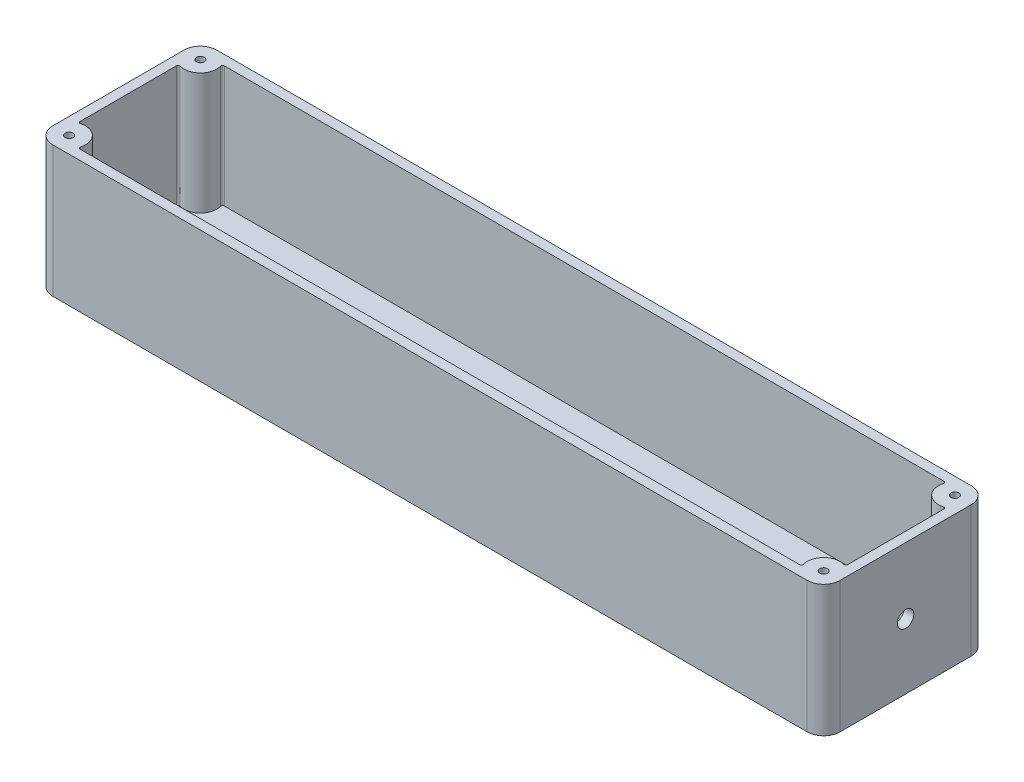
ISO-10303-21;
HEADER;
FILE_DESCRIPTION(('STEP AP214'),'2;1');
FILE_NAME('part.step','',(''),(''),'','','');
FILE_SCHEMA(('AUTOMOTIVE_DESIGN { 1 0 10303 214 1 1 1 1 }'));
ENDSEC;
DATA;
#1=APPLICATION_CONTEXT('core data for automotive mechanical design processes');
#2=APPLICATION_PROTOCOL_DEFINITION('international standard','automotive_design',2000,#1);
#3=PRODUCT_CONTEXT('',#1,'mechanical');
#4=PRODUCT('Part','Part','',(#3));
#5=PRODUCT_RELATED_PRODUCT_CATEGORY('part','',(#4));
#6=PRODUCT_DEFINITION_FORMATION('','',#4);
#7=PRODUCT_DEFINITION_CONTEXT('part definition',#1,'design');
#8=PRODUCT_DEFINITION('design','',#6,#7);
#9=PRODUCT_DEFINITION_SHAPE('','',#8);
#10=(LENGTH_UNIT() NAMED_UNIT(*) SI_UNIT(.MILLI.,.METRE.));
#11=(NAMED_UNIT(*) PLANE_ANGLE_UNIT() SI_UNIT($,.RADIAN.));
#12=(NAMED_UNIT(*) SI_UNIT($,.STERADIAN.) SOLID_ANGLE_UNIT());
#13=UNCERTAINTY_MEASURE_WITH_UNIT(LENGTH_MEASURE(1.E-05),#10,'distance_accuracy_value','');
#14=(GEOMETRIC_REPRESENTATION_CONTEXT(3) GLOBAL_UNCERTAINTY_ASSIGNED_CONTEXT((#13)) GLOBAL_UNIT_ASSIGNED_CONTEXT((#10,
#11,#12)) REPRESENTATION_CONTEXT('',''));
#15=CARTESIAN_POINT('',(0.,0.,0.));
#16=DIRECTION('',(0.,0.,1.));
#17=DIRECTION('',(1.,0.,0.));
#18=AXIS2_PLACEMENT_3D('',#15,#16,#17);
#19=CARTESIAN_POINT('',(115.,40.,-20.));
#20=DIRECTION('',(0.,-1.,0.));
#21=DIRECTION('',(0.,0.,-1.));
#22=AXIS2_PLACEMENT_3D('',#19,#20,#21);
#23=CYLINDRICAL_SURFACE('',#22,5.);
#24=CARTESIAN_POINT('',(115.,0.,-20.));
#25=DIRECTION('',(0.,1.,0.));
#26=DIRECTION('',(0.,0.,-1.));
#27=AXIS2_PLACEMENT_3D('',#24,#25,#26);
#28=CIRCLE('',#27,5.);
#29=CARTESIAN_POINT('',(120.,0.,-20.));
#30=VERTEX_POINT('',#29);
#31=CARTESIAN_POINT('',(115.,0.,-25.));
#32=VERTEX_POINT('',#31);
#33=EDGE_CURVE('E152',#30,#32,#28,.T.);
#34=ORIENTED_EDGE('',*,*,#33,.T.);
#35=DIRECTION('',(0.,-1.,0.));
#36=VECTOR('',#35,1.);
#37=CARTESIAN_POINT('',(115.,40.,-25.));
#38=LINE('',#37,#36);
#39=CARTESIAN_POINT('',(115.,40.,-25.));
#40=VERTEX_POINT('',#39);
#41=EDGE_CURVE('E11',#40,#32,#38,.T.);
#42=ORIENTED_EDGE('',*,*,#41,.F.);
#43=CARTESIAN_POINT('',(115.,40.,-20.));
#44=DIRECTION('',(0.,1.,0.));
#45=DIRECTION('',(0.,0.,-1.));
#46=AXIS2_PLACEMENT_3D('',#43,#44,#45);
#47=CIRCLE('',#46,5.);
#48=CARTESIAN_POINT('',(120.,40.,-20.));
#49=VERTEX_POINT('',#48);
#50=EDGE_CURVE('E176',#49,#40,#47,.T.);
#51=ORIENTED_EDGE('',*,*,#50,.F.);
#52=DIRECTION('',(0.,-1.,0.));
#53=VECTOR('',#52,1.);
#54=CARTESIAN_POINT('',(120.,40.,-20.));
#55=LINE('',#54,#53);
#56=EDGE_CURVE('E148',#49,#30,#55,.T.);
#57=ORIENTED_EDGE('',*,*,#56,.T.);
#58=EDGE_LOOP('',(#34,#42,#51,#57));
#59=FACE_BOUND('',#58,.T.);
#60=ADVANCED_FACE('F38',(#59),#23,.T.);
#61=CARTESIAN_POINT('',(-115.,40.,-25.));
#62=DIRECTION('',(0.,0.,1.));
#63=DIRECTION('',(1.,0.,0.));
#64=AXIS2_PLACEMENT_3D('',#61,#62,#63);
#65=PLANE('',#64);
#66=DIRECTION('',(-1.,0.,0.));
#67=VECTOR('',#66,1.);
#68=CARTESIAN_POINT('',(-115.,0.,-25.));
#69=LINE('',#68,#67);
#70=CARTESIAN_POINT('',(-115.,0.,-25.));
#71=VERTEX_POINT('',#70);
#72=EDGE_CURVE('E156',#32,#71,#69,.T.);
#73=ORIENTED_EDGE('',*,*,#72,.T.);
#74=DIRECTION('',(0.,-1.,0.));
#75=VECTOR('',#74,1.);
#76=CARTESIAN_POINT('',(-115.,40.,-25.));
#77=LINE('',#76,#75);
#78=CARTESIAN_POINT('',(-115.,40.,-25.));
#79=VERTEX_POINT('',#78);
#80=EDGE_CURVE('E47',#79,#71,#77,.T.);
#81=ORIENTED_EDGE('',*,*,#80,.F.);
#82=DIRECTION('',(-1.,0.,0.));
#83=VECTOR('',#82,1.);
#84=CARTESIAN_POINT('',(-115.,40.,-25.));
#85=LINE('',#84,#83);
#86=EDGE_CURVE('E104',#40,#79,#85,.T.);
#87=ORIENTED_EDGE('',*,*,#86,.F.);
#88=ORIENTED_EDGE('',*,*,#41,.T.);
#89=EDGE_LOOP('',(#73,#81,#87,#88));
#90=FACE_BOUND('',#89,.T.);
#91=ADVANCED_FACE('F463',(#90),#65,.F.);
#92=CARTESIAN_POINT('',(-115.,40.,-20.));
#93=DIRECTION('',(0.,-1.,0.));
#94=DIRECTION('',(0.,0.,-1.));
#95=AXIS2_PLACEMENT_3D('',#92,#93,#94);
#96=CYLINDRICAL_SURFACE('',#95,5.);
#97=CARTESIAN_POINT('',(-115.,0.,-20.));
#98=DIRECTION('',(0.,1.,0.));
#99=DIRECTION('',(0.,0.,1.));
#100=AXIS2_PLACEMENT_3D('',#97,#98,#99);
#101=CIRCLE('',#100,5.);
#102=CARTESIAN_POINT('',(-120.,0.,-20.));
#103=VERTEX_POINT('',#102);
#104=EDGE_CURVE('E160',#71,#103,#101,.T.);
#105=ORIENTED_EDGE('',*,*,#104,.T.);
#106=DIRECTION('',(0.,-1.,0.));
#107=VECTOR('',#106,1.);
#108=CARTESIAN_POINT('',(-120.,40.,-20.));
#109=LINE('',#108,#107);
#110=CARTESIAN_POINT('',(-120.,40.,-20.));
#111=VERTEX_POINT('',#110);
#112=EDGE_CURVE('E187',#111,#103,#109,.T.);
#113=ORIENTED_EDGE('',*,*,#112,.F.);
#114=CARTESIAN_POINT('',(-115.,40.,-20.));
#115=DIRECTION('',(0.,1.,0.));
#116=DIRECTION('',(0.,0.,1.));
#117=AXIS2_PLACEMENT_3D('',#114,#115,#116);
#118=CIRCLE('',#117,5.);
#119=EDGE_CURVE('E198',#79,#111,#118,.T.);
#120=ORIENTED_EDGE('',*,*,#119,.F.);
#121=ORIENTED_EDGE('',*,*,#80,.T.);
#122=EDGE_LOOP('',(#105,#113,#120,#121));
#123=FACE_BOUND('',#122,.T.);
#124=ADVANCED_FACE('F196',(#123),#96,.T.);
#125=CARTESIAN_POINT('',(-120.,40.,-20.));
#126=DIRECTION('',(1.,0.,0.));
#127=DIRECTION('',(0.,0.,-1.));
#128=AXIS2_PLACEMENT_3D('',#125,#126,#127);
#129=PLANE('',#128);
#130=DIRECTION('',(0.,0.,1.));
#131=VECTOR('',#130,1.);
#132=CARTESIAN_POINT('',(-120.,0.,-20.));
#133=LINE('',#132,#131);
#134=CARTESIAN_POINT('',(-120.,0.,20.));
#135=VERTEX_POINT('',#134);
#136=EDGE_CURVE('E163',#103,#135,#133,.T.);
#137=ORIENTED_EDGE('',*,*,#136,.T.);
#138=DIRECTION('',(0.,-1.,0.));
#139=VECTOR('',#138,1.);
#140=CARTESIAN_POINT('',(-120.,40.,20.));
#141=LINE('',#140,#139);
#142=CARTESIAN_POINT('',(-120.,40.,20.));
#143=VERTEX_POINT('',#142);
#144=EDGE_CURVE('E183',#143,#135,#141,.T.);
#145=ORIENTED_EDGE('',*,*,#144,.F.);
#146=DIRECTION('',(0.,0.,1.));
#147=VECTOR('',#146,1.);
#148=CARTESIAN_POINT('',(-120.,40.,-20.));
#149=LINE('',#148,#147);
#150=EDGE_CURVE('E211',#111,#143,#149,.T.);
#151=ORIENTED_EDGE('',*,*,#150,.F.);
#152=ORIENTED_EDGE('',*,*,#112,.T.);
#153=EDGE_LOOP('',(#137,#145,#151,#152));
#154=FACE_BOUND('',#153,.T.);
#155=ADVANCED_FACE('F206',(#154),#129,.F.);
#156=CARTESIAN_POINT('',(-115.,40.,20.));
#157=DIRECTION('',(0.,-1.,0.));
#158=DIRECTION('',(0.,0.,-1.));
#159=AXIS2_PLACEMENT_3D('',#156,#157,#158);
#160=CYLINDRICAL_SURFACE('',#159,5.);
#161=CARTESIAN_POINT('',(-115.,0.,20.));
#162=DIRECTION('',(0.,1.,0.));
#163=DIRECTION('',(0.,0.,1.));
#164=AXIS2_PLACEMENT_3D('',#161,#162,#163);
#165=CIRCLE('',#164,5.);
#166=CARTESIAN_POINT('',(-115.,0.,25.));
#167=VERTEX_POINT('',#166);
#168=EDGE_CURVE('E166',#135,#167,#165,.T.);
#169=ORIENTED_EDGE('',*,*,#168,.T.);
#170=DIRECTION('',(0.,-1.,0.));
#171=VECTOR('',#170,1.);
#172=CARTESIAN_POINT('',(-115.,40.,25.));
#173=LINE('',#172,#171);
#174=CARTESIAN_POINT('',(-115.,40.,25.));
#175=VERTEX_POINT('',#174);
#176=EDGE_CURVE('E141',#175,#167,#173,.T.);
#177=ORIENTED_EDGE('',*,*,#176,.F.);
#178=CARTESIAN_POINT('',(-115.,40.,20.));
#179=DIRECTION('',(0.,1.,0.));
#180=DIRECTION('',(0.,0.,1.));
#181=AXIS2_PLACEMENT_3D('',#178,#179,#180);
#182=CIRCLE('',#181,5.);
#183=EDGE_CURVE('E127',#143,#175,#182,.T.);
#184=ORIENTED_EDGE('',*,*,#183,.F.);
#185=ORIENTED_EDGE('',*,*,#144,.T.);
#186=EDGE_LOOP('',(#169,#177,#184,#185));
#187=FACE_BOUND('',#186,.T.);
#188=ADVANCED_FACE('F209',(#187),#160,.T.);
#189=CARTESIAN_POINT('',(-115.,40.,25.));
#190=DIRECTION('',(0.,0.,-1.));
#191=DIRECTION('',(-1.,0.,0.));
#192=AXIS2_PLACEMENT_3D('',#189,#190,#191);
#193=PLANE('',#192);
#194=DIRECTION('',(1.,0.,0.));
#195=VECTOR('',#194,1.);
#196=CARTESIAN_POINT('',(-115.,0.,25.));
#197=LINE('',#196,#195);
#198=CARTESIAN_POINT('',(115.,0.,25.));
#199=VERTEX_POINT('',#198);
#200=EDGE_CURVE('E137',#167,#199,#197,.T.);
#201=ORIENTED_EDGE('',*,*,#200,.T.);
#202=DIRECTION('',(0.,-1.,0.));
#203=VECTOR('',#202,1.);
#204=CARTESIAN_POINT('',(115.,40.,25.));
#205=LINE('',#204,#203);
#206=CARTESIAN_POINT('',(115.,40.,25.));
#207=VERTEX_POINT('',#206);
#208=EDGE_CURVE('E134',#207,#199,#205,.T.);
#209=ORIENTED_EDGE('',*,*,#208,.F.);
#210=DIRECTION('',(1.,0.,0.));
#211=VECTOR('',#210,1.);
#212=CARTESIAN_POINT('',(-115.,40.,25.));
#213=LINE('',#212,#211);
#214=EDGE_CURVE('E120',#175,#207,#213,.T.);
#215=ORIENTED_EDGE('',*,*,#214,.F.);
#216=ORIENTED_EDGE('',*,*,#176,.T.);
#217=EDGE_LOOP('',(#201,#209,#215,#216));
#218=FACE_BOUND('',#217,.T.);
#219=ADVANCED_FACE('F135',(#218),#193,.F.);
#220=CARTESIAN_POINT('',(115.,40.,20.));
#221=DIRECTION('',(0.,-1.,0.));
#222=DIRECTION('',(0.,0.,-1.));
#223=AXIS2_PLACEMENT_3D('',#220,#221,#222);
#224=CYLINDRICAL_SURFACE('',#223,5.);
#225=CARTESIAN_POINT('',(115.,0.,20.));
#226=DIRECTION('',(0.,1.,0.));
#227=DIRECTION('',(0.,0.,1.));
#228=AXIS2_PLACEMENT_3D('',#225,#226,#227);
#229=CIRCLE('',#228,5.);
#230=CARTESIAN_POINT('',(120.,0.,20.));
#231=VERTEX_POINT('',#230);
#232=EDGE_CURVE('E171',#199,#231,#229,.T.);
#233=ORIENTED_EDGE('',*,*,#232,.T.);
#234=DIRECTION('',(0.,-1.,0.));
#235=VECTOR('',#234,1.);
#236=CARTESIAN_POINT('',(120.,40.,20.));
#237=LINE('',#236,#235);
#238=CARTESIAN_POINT('',(120.,40.,20.));
#239=VERTEX_POINT('',#238);
#240=EDGE_CURVE('E142',#239,#231,#237,.T.);
#241=ORIENTED_EDGE('',*,*,#240,.F.);
#242=CARTESIAN_POINT('',(115.,40.,20.));
#243=DIRECTION('',(0.,1.,0.));
#244=DIRECTION('',(0.,0.,1.));
#245=AXIS2_PLACEMENT_3D('',#242,#243,#244);
#246=CIRCLE('',#245,5.);
#247=EDGE_CURVE('E124',#207,#239,#246,.T.);
#248=ORIENTED_EDGE('',*,*,#247,.F.);
#249=ORIENTED_EDGE('',*,*,#208,.T.);
#250=EDGE_LOOP('',(#233,#241,#248,#249));
#251=FACE_BOUND('',#250,.T.);
#252=ADVANCED_FACE('F144',(#251),#224,.T.);
#253=CARTESIAN_POINT('',(120.,40.,-20.));
#254=DIRECTION('',(-1.,0.,0.));
#255=DIRECTION('',(0.,0.,1.));
#256=AXIS2_PLACEMENT_3D('',#253,#254,#255);
#257=PLANE('',#256);
#258=CARTESIAN_POINT('',(120.,19.8177670051511,0.));
#259=DIRECTION('',(1.,0.,0.));
#260=DIRECTION('',(0.,0.,-1.));
#261=AXIS2_PLACEMENT_3D('',#258,#259,#260);
#262=CIRCLE('',#261,2.5);
#263=CARTESIAN_POINT('',(120.,19.8177670051511,-2.50000000000004));
#264=VERTEX_POINT('',#263);
#265=EDGE_CURVE('E440',#264,#264,#262,.T.);
#266=ORIENTED_EDGE('',*,*,#265,.F.);
#267=EDGE_LOOP('',(#266));
#268=FACE_BOUND('',#267,.T.);
#269=DIRECTION('',(0.,0.,-1.));
#270=VECTOR('',#269,1.);
#271=CARTESIAN_POINT('',(120.,0.,-20.));
#272=LINE('',#271,#270);
#273=EDGE_CURVE('E96',#231,#30,#272,.T.);
#274=ORIENTED_EDGE('',*,*,#273,.T.);
#275=ORIENTED_EDGE('',*,*,#56,.F.);
#276=DIRECTION('',(0.,0.,-1.));
#277=VECTOR('',#276,1.);
#278=CARTESIAN_POINT('',(120.,40.,-20.));
#279=LINE('',#278,#277);
#280=EDGE_CURVE('E63',#239,#49,#279,.T.);
#281=ORIENTED_EDGE('',*,*,#280,.F.);
#282=ORIENTED_EDGE('',*,*,#240,.T.);
#283=EDGE_LOOP('',(#274,#275,#281,#282));
#284=FACE_BOUND('',#283,.T.);
#285=ADVANCED_FACE('F470',(#268,#284),#257,.F.);
#286=CARTESIAN_POINT('',(115.,40.,-20.));
#287=DIRECTION('',(0.,-1.,0.));
#288=DIRECTION('',(0.,0.,-1.));
#289=AXIS2_PLACEMENT_3D('',#286,#287,#288);
#290=PLANE('',#289);
#291=CARTESIAN_POINT('',(-115.,40.,-20.));
#292=DIRECTION('',(0.,1.,0.));
#293=DIRECTION('',(0.,0.,1.));
#294=AXIS2_PLACEMENT_3D('',#291,#292,#293);
#295=CIRCLE('',#294,1.19999999999999);
#296=CARTESIAN_POINT('',(-115.,40.,-18.8));
#297=VERTEX_POINT('',#296);
#298=EDGE_CURVE('E436',#297,#297,#295,.T.);
#299=ORIENTED_EDGE('',*,*,#298,.F.);
#300=EDGE_LOOP('',(#299));
#301=FACE_BOUND('',#300,.T.);
#302=CARTESIAN_POINT('',(-115.,40.,20.));
#303=DIRECTION('',(0.,1.,0.));
#304=DIRECTION('',(0.,0.,1.));
#305=AXIS2_PLACEMENT_3D('',#302,#303,#304);
#306=CIRCLE('',#305,1.19999999999999);
#307=CARTESIAN_POINT('',(-115.,40.,21.2));
#308=VERTEX_POINT('',#307);
#309=EDGE_CURVE('E428',#308,#308,#306,.T.);
#310=ORIENTED_EDGE('',*,*,#309,.F.);
#311=EDGE_LOOP('',(#310));
#312=FACE_BOUND('',#311,.T.);
#313=CARTESIAN_POINT('',(115.,40.,20.));
#314=DIRECTION('',(0.,1.,0.));
#315=DIRECTION('',(0.,0.,1.));
#316=AXIS2_PLACEMENT_3D('',#313,#314,#315);
#317=CIRCLE('',#316,1.19999999999999);
#318=CARTESIAN_POINT('',(115.,40.,21.2));
#319=VERTEX_POINT('',#318);
#320=EDGE_CURVE('E420',#319,#319,#317,.T.);
#321=ORIENTED_EDGE('',*,*,#320,.F.);
#322=EDGE_LOOP('',(#321));
#323=FACE_BOUND('',#322,.T.);
#324=CARTESIAN_POINT('',(115.,40.,-20.));
#325=DIRECTION('',(0.,1.,0.));
#326=DIRECTION('',(0.,0.,1.));
#327=AXIS2_PLACEMENT_3D('',#324,#325,#326);
#328=CIRCLE('',#327,1.19999999999999);
#329=CARTESIAN_POINT('',(115.,40.,-18.8));
#330=VERTEX_POINT('',#329);
#331=EDGE_CURVE('E412',#330,#330,#328,.T.);
#332=ORIENTED_EDGE('',*,*,#331,.F.);
#333=EDGE_LOOP('',(#332));
#334=FACE_BOUND('',#333,.T.);
#335=CARTESIAN_POINT('',(115.,40.,-20.));
#336=DIRECTION('',(0.,1.,0.));
#337=DIRECTION('',(0.,0.,1.));
#338=AXIS2_PLACEMENT_3D('',#335,#336,#337);
#339=CIRCLE('',#338,4.99999999999999);
#340=CARTESIAN_POINT('',(110.189543070792,40.,-21.3636363636363));
#341=VERTEX_POINT('',#340);
#342=CARTESIAN_POINT('',(116.363636363636,40.,-15.1895430707916));
#343=VERTEX_POINT('',#342);
#344=EDGE_CURVE('E54',#341,#343,#339,.T.);
#345=ORIENTED_EDGE('',*,*,#344,.T.);
#346=CARTESIAN_POINT('',(116.5,40.,-14.7084973778708));
#347=DIRECTION('',(0.,1.,0.));
#348=DIRECTION('',(0.,0.,1.));
#349=AXIS2_PLACEMENT_3D('',#346,#347,#348);
#350=CIRCLE('',#349,0.499999999999979);
#351=CARTESIAN_POINT('',(117.,40.,-14.7084973778708));
#352=VERTEX_POINT('',#351);
#353=EDGE_CURVE('E283',#343,#352,#350,.F.);
#354=ORIENTED_EDGE('',*,*,#353,.T.);
#355=DIRECTION('',(0.,0.,-1.));
#356=VECTOR('',#355,1.);
#357=CARTESIAN_POINT('',(117.,40.,0.));
#358=LINE('',#357,#356);
#359=CARTESIAN_POINT('',(117.,40.,14.7084973778708));
#360=VERTEX_POINT('',#359);
#361=EDGE_CURVE('E288',#360,#352,#358,.T.);
#362=ORIENTED_EDGE('',*,*,#361,.F.);
#363=CARTESIAN_POINT('',(116.5,40.,14.7084973778708));
#364=DIRECTION('',(0.,1.,0.));
#365=DIRECTION('',(0.,0.,1.));
#366=AXIS2_PLACEMENT_3D('',#363,#364,#365);
#367=CIRCLE('',#366,0.500000000000009);
#368=CARTESIAN_POINT('',(116.363636363636,40.,15.1895430707916));
#369=VERTEX_POINT('',#368);
#370=EDGE_CURVE('E292',#369,#360,#367,.T.);
#371=ORIENTED_EDGE('',*,*,#370,.F.);
#372=CARTESIAN_POINT('',(115.,40.,20.));
#373=DIRECTION('',(0.,1.,0.));
#374=DIRECTION('',(0.,0.,1.));
#375=AXIS2_PLACEMENT_3D('',#372,#373,#374);
#376=CIRCLE('',#375,5.00000000000001);
#377=CARTESIAN_POINT('',(110.189543070792,40.,21.3636363636363));
#378=VERTEX_POINT('',#377);
#379=EDGE_CURVE('E296',#369,#378,#376,.T.);
#380=ORIENTED_EDGE('',*,*,#379,.T.);
#381=CARTESIAN_POINT('',(109.708497377871,40.,21.4999999999999));
#382=DIRECTION('',(0.,1.,0.));
#383=DIRECTION('',(0.,0.,1.));
#384=AXIS2_PLACEMENT_3D('',#381,#382,#383);
#385=CIRCLE('',#384,0.500000000000037);
#386=CARTESIAN_POINT('',(109.708497377871,40.,22.));
#387=VERTEX_POINT('',#386);
#388=EDGE_CURVE('E300',#387,#378,#385,.T.);
#389=ORIENTED_EDGE('',*,*,#388,.F.);
#390=DIRECTION('',(1.,0.,0.));
#391=VECTOR('',#390,1.);
#392=CARTESIAN_POINT('',(0.,40.,22.));
#393=LINE('',#392,#391);
#394=CARTESIAN_POINT('',(-109.708497377871,40.,22.));
#395=VERTEX_POINT('',#394);
#396=EDGE_CURVE('E304',#395,#387,#393,.T.);
#397=ORIENTED_EDGE('',*,*,#396,.F.);
#398=CARTESIAN_POINT('',(-109.708497377871,40.,21.5));
#399=DIRECTION('',(0.,1.,0.));
#400=DIRECTION('',(0.,0.,1.));
#401=AXIS2_PLACEMENT_3D('',#398,#399,#400);
#402=CIRCLE('',#401,0.500000000000037);
#403=CARTESIAN_POINT('',(-110.189543070792,40.,21.3636363636363));
#404=VERTEX_POINT('',#403);
#405=EDGE_CURVE('E308',#395,#404,#402,.F.);
#406=ORIENTED_EDGE('',*,*,#405,.T.);
#407=CARTESIAN_POINT('',(-115.,40.,20.));
#408=DIRECTION('',(0.,1.,0.));
#409=DIRECTION('',(0.,0.,1.));
#410=AXIS2_PLACEMENT_3D('',#407,#408,#409);
#411=CIRCLE('',#410,5.00000000000002);
#412=CARTESIAN_POINT('',(-116.363636363636,40.,15.1895430707917));
#413=VERTEX_POINT('',#412);
#414=EDGE_CURVE('E312',#404,#413,#411,.T.);
#415=ORIENTED_EDGE('',*,*,#414,.T.);
#416=CARTESIAN_POINT('',(-116.5,40.,14.7084973778708));
#417=DIRECTION('',(0.,1.,0.));
#418=DIRECTION('',(0.,0.,1.));
#419=AXIS2_PLACEMENT_3D('',#416,#417,#418);
#420=CIRCLE('',#419,0.500000000000026);
#421=CARTESIAN_POINT('',(-117.,40.,14.7084973778708));
#422=VERTEX_POINT('',#421);
#423=EDGE_CURVE('E316',#413,#422,#420,.F.);
#424=ORIENTED_EDGE('',*,*,#423,.T.);
#425=DIRECTION('',(0.,0.,1.));
#426=VECTOR('',#425,1.);
#427=CARTESIAN_POINT('',(-117.,40.,0.));
#428=LINE('',#427,#426);
#429=CARTESIAN_POINT('',(-117.,40.,-14.7084973778708));
#430=VERTEX_POINT('',#429);
#431=EDGE_CURVE('E320',#430,#422,#428,.T.);
#432=ORIENTED_EDGE('',*,*,#431,.F.);
#433=CARTESIAN_POINT('',(-116.5,40.,-14.7084973778708));
#434=DIRECTION('',(0.,1.,0.));
#435=DIRECTION('',(0.,0.,1.));
#436=AXIS2_PLACEMENT_3D('',#433,#434,#435);
#437=CIRCLE('',#436,0.499999999999999);
#438=CARTESIAN_POINT('',(-116.363636363636,40.,-15.1895430707916));
#439=VERTEX_POINT('',#438);
#440=EDGE_CURVE('E324',#439,#430,#437,.T.);
#441=ORIENTED_EDGE('',*,*,#440,.F.);
#442=CARTESIAN_POINT('',(-115.,40.,-20.));
#443=DIRECTION('',(0.,1.,0.));
#444=DIRECTION('',(0.,0.,1.));
#445=AXIS2_PLACEMENT_3D('',#442,#443,#444);
#446=CIRCLE('',#445,5.);
#447=CARTESIAN_POINT('',(-110.189543070792,40.,-21.3636363636363));
#448=VERTEX_POINT('',#447);
#449=EDGE_CURVE('E328',#439,#448,#446,.T.);
#450=ORIENTED_EDGE('',*,*,#449,.T.);
#451=CARTESIAN_POINT('',(-109.708497377871,40.,-21.5));
#452=DIRECTION('',(0.,1.,0.));
#453=DIRECTION('',(0.,0.,1.));
#454=AXIS2_PLACEMENT_3D('',#451,#452,#453);
#455=CIRCLE('',#454,0.500000000000026);
#456=CARTESIAN_POINT('',(-109.708497377871,40.,-22.));
#457=VERTEX_POINT('',#456);
#458=EDGE_CURVE('E332',#457,#448,#455,.T.);
#459=ORIENTED_EDGE('',*,*,#458,.F.);
#460=DIRECTION('',(-1.,0.,0.));
#461=VECTOR('',#460,1.);
#462=CARTESIAN_POINT('',(0.,40.,-22.));
#463=LINE('',#462,#461);
#464=CARTESIAN_POINT('',(109.708497377871,40.,-22.));
#465=VERTEX_POINT('',#464);
#466=EDGE_CURVE('E336',#465,#457,#463,.T.);
#467=ORIENTED_EDGE('',*,*,#466,.F.);
#468=CARTESIAN_POINT('',(109.708497377871,40.,-21.4999999999999));
#469=DIRECTION('',(0.,1.,0.));
#470=DIRECTION('',(0.,0.,1.));
#471=AXIS2_PLACEMENT_3D('',#468,#469,#470);
#472=CIRCLE('',#471,0.500000000000026);
#473=EDGE_CURVE('E340',#465,#341,#472,.F.);
#474=ORIENTED_EDGE('',*,*,#473,.T.);
#475=EDGE_LOOP('',(#345,#354,#362,#371,#380,#389,#397,#406,#415,#424,#432,#441,#450,#459,#467,#474));
#476=FACE_BOUND('',#475,.T.);
#477=ORIENTED_EDGE('',*,*,#50,.T.);
#478=ORIENTED_EDGE('',*,*,#86,.T.);
#479=ORIENTED_EDGE('',*,*,#119,.T.);
#480=ORIENTED_EDGE('',*,*,#150,.T.);
#481=ORIENTED_EDGE('',*,*,#183,.T.);
#482=ORIENTED_EDGE('',*,*,#214,.T.);
#483=ORIENTED_EDGE('',*,*,#247,.T.);
#484=ORIENTED_EDGE('',*,*,#280,.T.);
#485=EDGE_LOOP('',(#477,#478,#479,#480,#481,#482,#483,#484));
#486=FACE_BOUND('',#485,.T.);
#487=ADVANCED_FACE('F122',(#301,#312,#323,#334,#476,#486),#290,.F.);
#488=CARTESIAN_POINT('',(115.,0.,-20.));
#489=DIRECTION('',(0.,-1.,0.));
#490=DIRECTION('',(0.,0.,-1.));
#491=AXIS2_PLACEMENT_3D('',#488,#489,#490);
#492=PLANE('',#491);
#493=ORIENTED_EDGE('',*,*,#33,.F.);
#494=ORIENTED_EDGE('',*,*,#273,.F.);
#495=ORIENTED_EDGE('',*,*,#232,.F.);
#496=ORIENTED_EDGE('',*,*,#200,.F.);
#497=ORIENTED_EDGE('',*,*,#168,.F.);
#498=ORIENTED_EDGE('',*,*,#136,.F.);
#499=ORIENTED_EDGE('',*,*,#104,.F.);
#500=ORIENTED_EDGE('',*,*,#72,.F.);
#501=EDGE_LOOP('',(#493,#494,#495,#496,#497,#498,#499,#500));
#502=FACE_BOUND('',#501,.T.);
#503=ADVANCED_FACE('F202',(#502),#492,.T.);
#504=CARTESIAN_POINT('',(115.,3.,-20.));
#505=DIRECTION('',(0.,1.,0.));
#506=DIRECTION('',(0.,0.,1.));
#507=AXIS2_PLACEMENT_3D('',#504,#505,#506);
#508=CYLINDRICAL_SURFACE('',#507,4.99999999999999);
#509=ORIENTED_EDGE('',*,*,#344,.F.);
#510=DIRECTION('',(0.,1.,0.));
#511=VECTOR('',#510,1.);
#512=CARTESIAN_POINT('',(110.189543070792,3.,-21.3636363636363));
#513=LINE('',#512,#511);
#514=CARTESIAN_POINT('',(110.189543070792,3.,-21.3636363636363));
#515=VERTEX_POINT('',#514);
#516=EDGE_CURVE('E221',#515,#341,#513,.T.);
#517=ORIENTED_EDGE('',*,*,#516,.F.);
#518=CARTESIAN_POINT('',(115.,3.,-20.));
#519=DIRECTION('',(0.,1.,0.));
#520=DIRECTION('',(0.,0.,1.));
#521=AXIS2_PLACEMENT_3D('',#518,#519,#520);
#522=CIRCLE('',#521,4.99999999999999);
#523=CARTESIAN_POINT('',(116.363636363636,3.,-15.1895430707916));
#524=VERTEX_POINT('',#523);
#525=EDGE_CURVE('E287',#515,#524,#522,.T.);
#526=ORIENTED_EDGE('',*,*,#525,.T.);
#527=DIRECTION('',(0.,1.,0.));
#528=VECTOR('',#527,1.);
#529=CARTESIAN_POINT('',(116.363636363636,3.,-15.1895430707916));
#530=LINE('',#529,#528);
#531=EDGE_CURVE('E157',#524,#343,#530,.T.);
#532=ORIENTED_EDGE('',*,*,#531,.T.);
#533=EDGE_LOOP('',(#509,#517,#526,#532));
#534=FACE_BOUND('',#533,.T.);
#535=ADVANCED_FACE('F528',(#534),#508,.T.);
#536=CARTESIAN_POINT('',(116.5,3.,-14.7084973778708));
#537=DIRECTION('',(0.,1.,0.));
#538=DIRECTION('',(0.,0.,1.));
#539=AXIS2_PLACEMENT_3D('',#536,#537,#538);
#540=CYLINDRICAL_SURFACE('',#539,0.499999999999979);
#541=ORIENTED_EDGE('',*,*,#353,.F.);
#542=ORIENTED_EDGE('',*,*,#531,.F.);
#543=CARTESIAN_POINT('',(116.5,3.,-14.7084973778708));
#544=DIRECTION('',(0.,1.,0.));
#545=DIRECTION('',(0.,0.,1.));
#546=AXIS2_PLACEMENT_3D('',#543,#544,#545);
#547=CIRCLE('',#546,0.499999999999979);
#548=CARTESIAN_POINT('',(117.,3.,-14.7084973778708));
#549=VERTEX_POINT('',#548);
#550=EDGE_CURVE('E225',#524,#549,#547,.F.);
#551=ORIENTED_EDGE('',*,*,#550,.T.);
#552=DIRECTION('',(0.,1.,0.));
#553=VECTOR('',#552,1.);
#554=CARTESIAN_POINT('',(117.,3.,-14.7084973778708));
#555=LINE('',#554,#553);
#556=EDGE_CURVE('E277',#549,#352,#555,.T.);
#557=ORIENTED_EDGE('',*,*,#556,.T.);
#558=EDGE_LOOP('',(#541,#542,#551,#557));
#559=FACE_BOUND('',#558,.T.);
#560=ADVANCED_FACE('F534',(#559),#540,.F.);
#561=CARTESIAN_POINT('',(117.,3.,0.));
#562=DIRECTION('',(1.,0.,0.));
#563=DIRECTION('',(0.,0.,-1.));
#564=AXIS2_PLACEMENT_3D('',#561,#562,#563);
#565=PLANE('',#564);
#566=CARTESIAN_POINT('',(117.,19.8177670051511,0.));
#567=DIRECTION('',(1.,0.,0.));
#568=DIRECTION('',(0.,0.,-1.));
#569=AXIS2_PLACEMENT_3D('',#566,#567,#568);
#570=CIRCLE('',#569,2.5);
#571=CARTESIAN_POINT('',(117.,19.8177670051511,-2.50000000000004));
#572=VERTEX_POINT('',#571);
#573=EDGE_CURVE('E41',#572,#572,#570,.T.);
#574=ORIENTED_EDGE('',*,*,#573,.T.);
#575=EDGE_LOOP('',(#574));
#576=FACE_BOUND('',#575,.T.);
#577=ORIENTED_EDGE('',*,*,#361,.T.);
#578=ORIENTED_EDGE('',*,*,#556,.F.);
#579=DIRECTION('',(0.,0.,-1.));
#580=VECTOR('',#579,1.);
#581=CARTESIAN_POINT('',(117.,3.,0.));
#582=LINE('',#581,#580);
#583=CARTESIAN_POINT('',(117.,3.,14.7084973778708));
#584=VERTEX_POINT('',#583);
#585=EDGE_CURVE('E350',#584,#549,#582,.T.);
#586=ORIENTED_EDGE('',*,*,#585,.F.);
#587=DIRECTION('',(0.,1.,0.));
#588=VECTOR('',#587,1.);
#589=CARTESIAN_POINT('',(117.,3.,14.7084973778708));
#590=LINE('',#589,#588);
#591=EDGE_CURVE('E273',#584,#360,#590,.T.);
#592=ORIENTED_EDGE('',*,*,#591,.T.);
#593=EDGE_LOOP('',(#577,#578,#586,#592));
#594=FACE_BOUND('',#593,.T.);
#595=ADVANCED_FACE('F449',(#576,#594),#565,.F.);
#596=CARTESIAN_POINT('',(116.5,3.,14.7084973778708));
#597=DIRECTION('',(0.,1.,0.));
#598=DIRECTION('',(0.,0.,1.));
#599=AXIS2_PLACEMENT_3D('',#596,#597,#598);
#600=CYLINDRICAL_SURFACE('',#599,0.500000000000009);
#601=ORIENTED_EDGE('',*,*,#370,.T.);
#602=ORIENTED_EDGE('',*,*,#591,.F.);
#603=CARTESIAN_POINT('',(116.5,3.,14.7084973778708));
#604=DIRECTION('',(0.,1.,0.));
#605=DIRECTION('',(0.,0.,1.));
#606=AXIS2_PLACEMENT_3D('',#603,#604,#605);
#607=CIRCLE('',#606,0.500000000000009);
#608=CARTESIAN_POINT('',(116.363636363636,3.,15.1895430707916));
#609=VERTEX_POINT('',#608);
#610=EDGE_CURVE('E354',#609,#584,#607,.T.);
#611=ORIENTED_EDGE('',*,*,#610,.F.);
#612=DIRECTION('',(0.,1.,0.));
#613=VECTOR('',#612,1.);
#614=CARTESIAN_POINT('',(116.363636363636,3.,15.1895430707916));
#615=LINE('',#614,#613);
#616=EDGE_CURVE('E269',#609,#369,#615,.T.);
#617=ORIENTED_EDGE('',*,*,#616,.T.);
#618=EDGE_LOOP('',(#601,#602,#611,#617));
#619=FACE_BOUND('',#618,.T.);
#620=ADVANCED_FACE('F549',(#619),#600,.F.);
#621=CARTESIAN_POINT('',(115.,3.,20.));
#622=DIRECTION('',(0.,1.,0.));
#623=DIRECTION('',(0.,0.,1.));
#624=AXIS2_PLACEMENT_3D('',#621,#622,#623);
#625=CYLINDRICAL_SURFACE('',#624,5.00000000000001);
#626=ORIENTED_EDGE('',*,*,#379,.F.);
#627=ORIENTED_EDGE('',*,*,#616,.F.);
#628=CARTESIAN_POINT('',(115.,3.,20.));
#629=DIRECTION('',(0.,1.,0.));
#630=DIRECTION('',(0.,0.,1.));
#631=AXIS2_PLACEMENT_3D('',#628,#629,#630);
#632=CIRCLE('',#631,5.00000000000001);
#633=CARTESIAN_POINT('',(110.189543070792,3.,21.3636363636363));
#634=VERTEX_POINT('',#633);
#635=EDGE_CURVE('E358',#609,#634,#632,.T.);
#636=ORIENTED_EDGE('',*,*,#635,.T.);
#637=DIRECTION('',(0.,1.,0.));
#638=VECTOR('',#637,1.);
#639=CARTESIAN_POINT('',(110.189543070792,3.,21.3636363636363));
#640=LINE('',#639,#638);
#641=EDGE_CURVE('E265',#634,#378,#640,.T.);
#642=ORIENTED_EDGE('',*,*,#641,.T.);
#643=EDGE_LOOP('',(#626,#627,#636,#642));
#644=FACE_BOUND('',#643,.T.);
#645=ADVANCED_FACE('F557',(#644),#625,.T.);
#646=CARTESIAN_POINT('',(109.708497377871,3.,21.4999999999999));
#647=DIRECTION('',(0.,1.,0.));
#648=DIRECTION('',(0.,0.,1.));
#649=AXIS2_PLACEMENT_3D('',#646,#647,#648);
#650=CYLINDRICAL_SURFACE('',#649,0.500000000000037);
#651=ORIENTED_EDGE('',*,*,#388,.T.);
#652=ORIENTED_EDGE('',*,*,#641,.F.);
#653=CARTESIAN_POINT('',(109.708497377871,3.,21.4999999999999));
#654=DIRECTION('',(0.,1.,0.));
#655=DIRECTION('',(0.,0.,1.));
#656=AXIS2_PLACEMENT_3D('',#653,#654,#655);
#657=CIRCLE('',#656,0.500000000000037);
#658=CARTESIAN_POINT('',(109.708497377871,3.,22.));
#659=VERTEX_POINT('',#658);
#660=EDGE_CURVE('E362',#659,#634,#657,.T.);
#661=ORIENTED_EDGE('',*,*,#660,.F.);
#662=DIRECTION('',(0.,1.,0.));
#663=VECTOR('',#662,1.);
#664=CARTESIAN_POINT('',(109.708497377871,3.,22.));
#665=LINE('',#664,#663);
#666=EDGE_CURVE('E261',#659,#387,#665,.T.);
#667=ORIENTED_EDGE('',*,*,#666,.T.);
#668=EDGE_LOOP('',(#651,#652,#661,#667));
#669=FACE_BOUND('',#668,.T.);
#670=ADVANCED_FACE('F564',(#669),#650,.F.);
#671=CARTESIAN_POINT('',(0.,3.,22.));
#672=DIRECTION('',(0.,0.,1.));
#673=DIRECTION('',(1.,0.,0.));
#674=AXIS2_PLACEMENT_3D('',#671,#672,#673);
#675=PLANE('',#674);
#676=ORIENTED_EDGE('',*,*,#396,.T.);
#677=ORIENTED_EDGE('',*,*,#666,.F.);
#678=DIRECTION('',(1.,0.,0.));
#679=VECTOR('',#678,1.);
#680=CARTESIAN_POINT('',(0.,3.,22.));
#681=LINE('',#680,#679);
#682=CARTESIAN_POINT('',(-109.708497377871,3.,22.));
#683=VERTEX_POINT('',#682);
#684=EDGE_CURVE('E366',#683,#659,#681,.T.);
#685=ORIENTED_EDGE('',*,*,#684,.F.);
#686=DIRECTION('',(0.,1.,0.));
#687=VECTOR('',#686,1.);
#688=CARTESIAN_POINT('',(-109.708497377871,3.,22.));
#689=LINE('',#688,#687);
#690=EDGE_CURVE('E257',#683,#395,#689,.T.);
#691=ORIENTED_EDGE('',*,*,#690,.T.);
#692=EDGE_LOOP('',(#676,#677,#685,#691));
#693=FACE_BOUND('',#692,.T.);
#694=ADVANCED_FACE('F572',(#693),#675,.F.);
#695=CARTESIAN_POINT('',(-109.708497377871,3.,21.5));
#696=DIRECTION('',(0.,1.,0.));
#697=DIRECTION('',(0.,0.,1.));
#698=AXIS2_PLACEMENT_3D('',#695,#696,#697);
#699=CYLINDRICAL_SURFACE('',#698,0.500000000000037);
#700=ORIENTED_EDGE('',*,*,#405,.F.);
#701=ORIENTED_EDGE('',*,*,#690,.F.);
#702=CARTESIAN_POINT('',(-109.708497377871,3.,21.5));
#703=DIRECTION('',(0.,1.,0.));
#704=DIRECTION('',(0.,0.,1.));
#705=AXIS2_PLACEMENT_3D('',#702,#703,#704);
#706=CIRCLE('',#705,0.500000000000037);
#707=CARTESIAN_POINT('',(-110.189543070792,3.,21.3636363636363));
#708=VERTEX_POINT('',#707);
#709=EDGE_CURVE('E370',#683,#708,#706,.F.);
#710=ORIENTED_EDGE('',*,*,#709,.T.);
#711=DIRECTION('',(0.,1.,0.));
#712=VECTOR('',#711,1.);
#713=CARTESIAN_POINT('',(-110.189543070792,3.,21.3636363636363));
#714=LINE('',#713,#712);
#715=EDGE_CURVE('E253',#708,#404,#714,.T.);
#716=ORIENTED_EDGE('',*,*,#715,.T.);
#717=EDGE_LOOP('',(#700,#701,#710,#716));
#718=FACE_BOUND('',#717,.T.);
#719=ADVANCED_FACE('F580',(#718),#699,.F.);
#720=CARTESIAN_POINT('',(-115.,3.,20.));
#721=DIRECTION('',(0.,1.,0.));
#722=DIRECTION('',(0.,0.,1.));
#723=AXIS2_PLACEMENT_3D('',#720,#721,#722);
#724=CYLINDRICAL_SURFACE('',#723,5.00000000000002);
#725=ORIENTED_EDGE('',*,*,#414,.F.);
#726=ORIENTED_EDGE('',*,*,#715,.F.);
#727=CARTESIAN_POINT('',(-115.,3.,20.));
#728=DIRECTION('',(0.,1.,0.));
#729=DIRECTION('',(0.,0.,1.));
#730=AXIS2_PLACEMENT_3D('',#727,#728,#729);
#731=CIRCLE('',#730,5.00000000000002);
#732=CARTESIAN_POINT('',(-116.363636363636,3.,15.1895430707917));
#733=VERTEX_POINT('',#732);
#734=EDGE_CURVE('E374',#708,#733,#731,.T.);
#735=ORIENTED_EDGE('',*,*,#734,.T.);
#736=DIRECTION('',(0.,1.,0.));
#737=VECTOR('',#736,1.);
#738=CARTESIAN_POINT('',(-116.363636363636,3.,15.1895430707917));
#739=LINE('',#738,#737);
#740=EDGE_CURVE('E249',#733,#413,#739,.T.);
#741=ORIENTED_EDGE('',*,*,#740,.T.);
#742=EDGE_LOOP('',(#725,#726,#735,#741));
#743=FACE_BOUND('',#742,.T.);
#744=ADVANCED_FACE('F588',(#743),#724,.T.);
#745=CARTESIAN_POINT('',(-116.5,3.,14.7084973778708));
#746=DIRECTION('',(0.,1.,0.));
#747=DIRECTION('',(0.,0.,1.));
#748=AXIS2_PLACEMENT_3D('',#745,#746,#747);
#749=CYLINDRICAL_SURFACE('',#748,0.500000000000026);
#750=ORIENTED_EDGE('',*,*,#423,.F.);
#751=ORIENTED_EDGE('',*,*,#740,.F.);
#752=CARTESIAN_POINT('',(-116.5,3.,14.7084973778708));
#753=DIRECTION('',(0.,1.,0.));
#754=DIRECTION('',(0.,0.,1.));
#755=AXIS2_PLACEMENT_3D('',#752,#753,#754);
#756=CIRCLE('',#755,0.500000000000026);
#757=CARTESIAN_POINT('',(-117.,3.,14.7084973778708));
#758=VERTEX_POINT('',#757);
#759=EDGE_CURVE('E378',#733,#758,#756,.F.);
#760=ORIENTED_EDGE('',*,*,#759,.T.);
#761=DIRECTION('',(0.,1.,0.));
#762=VECTOR('',#761,1.);
#763=CARTESIAN_POINT('',(-117.,3.,14.7084973778708));
#764=LINE('',#763,#762);
#765=EDGE_CURVE('E245',#758,#422,#764,.T.);
#766=ORIENTED_EDGE('',*,*,#765,.T.);
#767=EDGE_LOOP('',(#750,#751,#760,#766));
#768=FACE_BOUND('',#767,.T.);
#769=ADVANCED_FACE('F596',(#768),#749,.F.);
#770=CARTESIAN_POINT('',(-117.,3.,0.));
#771=DIRECTION('',(-1.,0.,0.));
#772=DIRECTION('',(0.,0.,1.));
#773=AXIS2_PLACEMENT_3D('',#770,#771,#772);
#774=PLANE('',#773);
#775=ORIENTED_EDGE('',*,*,#431,.T.);
#776=ORIENTED_EDGE('',*,*,#765,.F.);
#777=DIRECTION('',(0.,0.,1.));
#778=VECTOR('',#777,1.);
#779=CARTESIAN_POINT('',(-117.,3.,0.));
#780=LINE('',#779,#778);
#781=CARTESIAN_POINT('',(-117.,3.,-14.7084973778708));
#782=VERTEX_POINT('',#781);
#783=EDGE_CURVE('E382',#782,#758,#780,.T.);
#784=ORIENTED_EDGE('',*,*,#783,.F.);
#785=DIRECTION('',(0.,1.,0.));
#786=VECTOR('',#785,1.);
#787=CARTESIAN_POINT('',(-117.,3.,-14.7084973778708));
#788=LINE('',#787,#786);
#789=EDGE_CURVE('E241',#782,#430,#788,.T.);
#790=ORIENTED_EDGE('',*,*,#789,.T.);
#791=EDGE_LOOP('',(#775,#776,#784,#790));
#792=FACE_BOUND('',#791,.T.);
#793=ADVANCED_FACE('F604',(#792),#774,.F.);
#794=CARTESIAN_POINT('',(-116.5,3.,-14.7084973778708));
#795=DIRECTION('',(0.,1.,0.));
#796=DIRECTION('',(0.,0.,1.));
#797=AXIS2_PLACEMENT_3D('',#794,#795,#796);
#798=CYLINDRICAL_SURFACE('',#797,0.499999999999999);
#799=ORIENTED_EDGE('',*,*,#440,.T.);
#800=ORIENTED_EDGE('',*,*,#789,.F.);
#801=CARTESIAN_POINT('',(-116.5,3.,-14.7084973778708));
#802=DIRECTION('',(0.,1.,0.));
#803=DIRECTION('',(0.,0.,1.));
#804=AXIS2_PLACEMENT_3D('',#801,#802,#803);
#805=CIRCLE('',#804,0.499999999999999);
#806=CARTESIAN_POINT('',(-116.363636363636,3.,-15.1895430707916));
#807=VERTEX_POINT('',#806);
#808=EDGE_CURVE('E386',#807,#782,#805,.T.);
#809=ORIENTED_EDGE('',*,*,#808,.F.);
#810=DIRECTION('',(0.,1.,0.));
#811=VECTOR('',#810,1.);
#812=CARTESIAN_POINT('',(-116.363636363636,3.,-15.1895430707916));
#813=LINE('',#812,#811);
#814=EDGE_CURVE('E237',#807,#439,#813,.T.);
#815=ORIENTED_EDGE('',*,*,#814,.T.);
#816=EDGE_LOOP('',(#799,#800,#809,#815));
#817=FACE_BOUND('',#816,.T.);
#818=ADVANCED_FACE('F612',(#817),#798,.F.);
#819=CARTESIAN_POINT('',(-115.,3.,-20.));
#820=DIRECTION('',(0.,1.,0.));
#821=DIRECTION('',(0.,0.,1.));
#822=AXIS2_PLACEMENT_3D('',#819,#820,#821);
#823=CYLINDRICAL_SURFACE('',#822,5.);
#824=ORIENTED_EDGE('',*,*,#449,.F.);
#825=ORIENTED_EDGE('',*,*,#814,.F.);
#826=CARTESIAN_POINT('',(-115.,3.,-20.));
#827=DIRECTION('',(0.,1.,0.));
#828=DIRECTION('',(0.,0.,1.));
#829=AXIS2_PLACEMENT_3D('',#826,#827,#828);
#830=CIRCLE('',#829,5.);
#831=CARTESIAN_POINT('',(-110.189543070792,3.,-21.3636363636363));
#832=VERTEX_POINT('',#831);
#833=EDGE_CURVE('E390',#807,#832,#830,.T.);
#834=ORIENTED_EDGE('',*,*,#833,.T.);
#835=DIRECTION('',(0.,1.,0.));
#836=VECTOR('',#835,1.);
#837=CARTESIAN_POINT('',(-110.189543070792,3.,-21.3636363636363));
#838=LINE('',#837,#836);
#839=EDGE_CURVE('E233',#832,#448,#838,.T.);
#840=ORIENTED_EDGE('',*,*,#839,.T.);
#841=EDGE_LOOP('',(#824,#825,#834,#840));
#842=FACE_BOUND('',#841,.T.);
#843=ADVANCED_FACE('F620',(#842),#823,.T.);
#844=CARTESIAN_POINT('',(-109.708497377871,3.,-21.5));
#845=DIRECTION('',(0.,1.,0.));
#846=DIRECTION('',(0.,0.,1.));
#847=AXIS2_PLACEMENT_3D('',#844,#845,#846);
#848=CYLINDRICAL_SURFACE('',#847,0.500000000000026);
#849=ORIENTED_EDGE('',*,*,#458,.T.);
#850=ORIENTED_EDGE('',*,*,#839,.F.);
#851=CARTESIAN_POINT('',(-109.708497377871,3.,-21.5));
#852=DIRECTION('',(0.,1.,0.));
#853=DIRECTION('',(0.,0.,1.));
#854=AXIS2_PLACEMENT_3D('',#851,#852,#853);
#855=CIRCLE('',#854,0.500000000000026);
#856=CARTESIAN_POINT('',(-109.708497377871,3.,-22.));
#857=VERTEX_POINT('',#856);
#858=EDGE_CURVE('E394',#857,#832,#855,.T.);
#859=ORIENTED_EDGE('',*,*,#858,.F.);
#860=DIRECTION('',(0.,1.,0.));
#861=VECTOR('',#860,1.);
#862=CARTESIAN_POINT('',(-109.708497377871,3.,-22.));
#863=LINE('',#862,#861);
#864=EDGE_CURVE('E229',#857,#457,#863,.T.);
#865=ORIENTED_EDGE('',*,*,#864,.T.);
#866=EDGE_LOOP('',(#849,#850,#859,#865));
#867=FACE_BOUND('',#866,.T.);
#868=ADVANCED_FACE('F628',(#867),#848,.F.);
#869=CARTESIAN_POINT('',(0.,3.,-22.));
#870=DIRECTION('',(0.,0.,-1.));
#871=DIRECTION('',(-1.,0.,0.));
#872=AXIS2_PLACEMENT_3D('',#869,#870,#871);
#873=PLANE('',#872);
#874=ORIENTED_EDGE('',*,*,#466,.T.);
#875=ORIENTED_EDGE('',*,*,#864,.F.);
#876=DIRECTION('',(-1.,0.,0.));
#877=VECTOR('',#876,1.);
#878=CARTESIAN_POINT('',(0.,3.,-22.));
#879=LINE('',#878,#877);
#880=CARTESIAN_POINT('',(109.708497377871,3.,-22.));
#881=VERTEX_POINT('',#880);
#882=EDGE_CURVE('E398',#881,#857,#879,.T.);
#883=ORIENTED_EDGE('',*,*,#882,.F.);
#884=DIRECTION('',(0.,1.,0.));
#885=VECTOR('',#884,1.);
#886=CARTESIAN_POINT('',(109.708497377871,3.,-22.));
#887=LINE('',#886,#885);
#888=EDGE_CURVE('E224',#881,#465,#887,.T.);
#889=ORIENTED_EDGE('',*,*,#888,.T.);
#890=EDGE_LOOP('',(#874,#875,#883,#889));
#891=FACE_BOUND('',#890,.T.);
#892=ADVANCED_FACE('F636',(#891),#873,.F.);
#893=CARTESIAN_POINT('',(109.708497377871,3.,-21.4999999999999));
#894=DIRECTION('',(0.,1.,0.));
#895=DIRECTION('',(0.,0.,1.));
#896=AXIS2_PLACEMENT_3D('',#893,#894,#895);
#897=CYLINDRICAL_SURFACE('',#896,0.500000000000026);
#898=ORIENTED_EDGE('',*,*,#473,.F.);
#899=ORIENTED_EDGE('',*,*,#888,.F.);
#900=CARTESIAN_POINT('',(109.708497377871,3.,-21.4999999999999));
#901=DIRECTION('',(0.,1.,0.));
#902=DIRECTION('',(0.,0.,1.));
#903=AXIS2_PLACEMENT_3D('',#900,#901,#902);
#904=CIRCLE('',#903,0.500000000000026);
#905=EDGE_CURVE('E402',#881,#515,#904,.F.);
#906=ORIENTED_EDGE('',*,*,#905,.T.);
#907=ORIENTED_EDGE('',*,*,#516,.T.);
#908=EDGE_LOOP('',(#898,#899,#906,#907));
#909=FACE_BOUND('',#908,.T.);
#910=ADVANCED_FACE('F644',(#909),#897,.F.);
#911=CARTESIAN_POINT('',(0.,3.,0.));
#912=DIRECTION('',(0.,1.,0.));
#913=DIRECTION('',(0.,0.,1.));
#914=AXIS2_PLACEMENT_3D('',#911,#912,#913);
#915=PLANE('',#914);
#916=ORIENTED_EDGE('',*,*,#525,.F.);
#917=ORIENTED_EDGE('',*,*,#905,.F.);
#918=ORIENTED_EDGE('',*,*,#882,.T.);
#919=ORIENTED_EDGE('',*,*,#858,.T.);
#920=ORIENTED_EDGE('',*,*,#833,.F.);
#921=ORIENTED_EDGE('',*,*,#808,.T.);
#922=ORIENTED_EDGE('',*,*,#783,.T.);
#923=ORIENTED_EDGE('',*,*,#759,.F.);
#924=ORIENTED_EDGE('',*,*,#734,.F.);
#925=ORIENTED_EDGE('',*,*,#709,.F.);
#926=ORIENTED_EDGE('',*,*,#684,.T.);
#927=ORIENTED_EDGE('',*,*,#660,.T.);
#928=ORIENTED_EDGE('',*,*,#635,.F.);
#929=ORIENTED_EDGE('',*,*,#610,.T.);
#930=ORIENTED_EDGE('',*,*,#585,.T.);
#931=ORIENTED_EDGE('',*,*,#550,.F.);
#932=EDGE_LOOP('',(#916,#917,#918,#919,#920,#921,#922,#923,#924,#925,#926,#927,#928,#929,#930,#931));
#933=FACE_BOUND('',#932,.T.);
#934=ADVANCED_FACE('F652',(#933),#915,.T.);
#935=CARTESIAN_POINT('',(115.,25.,-20.));
#936=DIRECTION('',(0.,1.,0.));
#937=DIRECTION('',(0.,0.,1.));
#938=AXIS2_PLACEMENT_3D('',#935,#936,#937);
#939=CONICAL_SURFACE('',#938,1.19999999999999,1.02974425867665);
#940=CARTESIAN_POINT('',(115.,24.2789672571669,-20.));
#941=VERTEX_POINT('',#940);
#942=VERTEX_LOOP('',#941);
#943=FACE_BOUND('',#942,.T.);
#944=CARTESIAN_POINT('',(115.,25.,-20.));
#945=DIRECTION('',(0.,1.,0.));
#946=DIRECTION('',(0.,0.,1.));
#947=AXIS2_PLACEMENT_3D('',#944,#945,#946);
#948=CIRCLE('',#947,1.19999999999999);
#949=CARTESIAN_POINT('',(115.,25.,-18.8));
#950=VERTEX_POINT('',#949);
#951=EDGE_CURVE('E346',#950,#950,#948,.T.);
#952=ORIENTED_EDGE('',*,*,#951,.T.);
#953=EDGE_LOOP('',(#952));
#954=FACE_BOUND('',#953,.T.);
#955=ADVANCED_FACE('F659',(#943,#954),#939,.F.);
#956=CARTESIAN_POINT('',(115.,40.,-20.));
#957=DIRECTION('',(0.,1.,0.));
#958=DIRECTION('',(0.,0.,1.));
#959=AXIS2_PLACEMENT_3D('',#956,#957,#958);
#960=CYLINDRICAL_SURFACE('',#959,1.19999999999999);
#961=ORIENTED_EDGE('',*,*,#951,.F.);
#962=EDGE_LOOP('',(#961));
#963=FACE_BOUND('',#962,.T.);
#964=ORIENTED_EDGE('',*,*,#331,.T.);
#965=EDGE_LOOP('',(#964));
#966=FACE_BOUND('',#965,.T.);
#967=ADVANCED_FACE('F666',(#963,#966),#960,.F.);
#968=CARTESIAN_POINT('',(115.,25.,20.));
#969=DIRECTION('',(0.,1.,0.));
#970=DIRECTION('',(0.,0.,1.));
#971=AXIS2_PLACEMENT_3D('',#968,#969,#970);
#972=CONICAL_SURFACE('',#971,1.19999999999999,1.02974425867665);
#973=CARTESIAN_POINT('',(115.,24.2789672571669,20.));
#974=VERTEX_POINT('',#973);
#975=VERTEX_LOOP('',#974);
#976=FACE_BOUND('',#975,.T.);
#977=CARTESIAN_POINT('',(115.,25.,20.));
#978=DIRECTION('',(0.,1.,0.));
#979=DIRECTION('',(0.,0.,1.));
#980=AXIS2_PLACEMENT_3D('',#977,#978,#979);
#981=CIRCLE('',#980,1.19999999999999);
#982=CARTESIAN_POINT('',(115.,25.,21.2));
#983=VERTEX_POINT('',#982);
#984=EDGE_CURVE('E416',#983,#983,#981,.T.);
#985=ORIENTED_EDGE('',*,*,#984,.T.);
#986=EDGE_LOOP('',(#985));
#987=FACE_BOUND('',#986,.T.);
#988=ADVANCED_FACE('F674',(#976,#987),#972,.F.);
#989=CARTESIAN_POINT('',(115.,40.,20.));
#990=DIRECTION('',(0.,1.,0.));
#991=DIRECTION('',(0.,0.,1.));
#992=AXIS2_PLACEMENT_3D('',#989,#990,#991);
#993=CYLINDRICAL_SURFACE('',#992,1.19999999999999);
#994=ORIENTED_EDGE('',*,*,#984,.F.);
#995=EDGE_LOOP('',(#994));
#996=FACE_BOUND('',#995,.T.);
#997=ORIENTED_EDGE('',*,*,#320,.T.);
#998=EDGE_LOOP('',(#997));
#999=FACE_BOUND('',#998,.T.);
#1000=ADVANCED_FACE('F682',(#996,#999),#993,.F.);
#1001=CARTESIAN_POINT('',(-115.,25.,20.));
#1002=DIRECTION('',(0.,1.,0.));
#1003=DIRECTION('',(0.,0.,1.));
#1004=AXIS2_PLACEMENT_3D('',#1001,#1002,#1003);
#1005=CONICAL_SURFACE('',#1004,1.19999999999999,1.02974425867665);
#1006=CARTESIAN_POINT('',(-115.,24.2789672571669,20.));
#1007=VERTEX_POINT('',#1006);
#1008=VERTEX_LOOP('',#1007);
#1009=FACE_BOUND('',#1008,.T.);
#1010=CARTESIAN_POINT('',(-115.,25.,20.));
#1011=DIRECTION('',(0.,1.,0.));
#1012=DIRECTION('',(0.,0.,1.));
#1013=AXIS2_PLACEMENT_3D('',#1010,#1011,#1012);
#1014=CIRCLE('',#1013,1.19999999999999);
#1015=CARTESIAN_POINT('',(-115.,25.,21.2));
#1016=VERTEX_POINT('',#1015);
#1017=EDGE_CURVE('E424',#1016,#1016,#1014,.T.);
#1018=ORIENTED_EDGE('',*,*,#1017,.T.);
#1019=EDGE_LOOP('',(#1018));
#1020=FACE_BOUND('',#1019,.T.);
#1021=ADVANCED_FACE('F690',(#1009,#1020),#1005,.F.);
#1022=CARTESIAN_POINT('',(-115.,40.,20.));
#1023=DIRECTION('',(0.,1.,0.));
#1024=DIRECTION('',(0.,0.,1.));
#1025=AXIS2_PLACEMENT_3D('',#1022,#1023,#1024);
#1026=CYLINDRICAL_SURFACE('',#1025,1.19999999999999);
#1027=ORIENTED_EDGE('',*,*,#1017,.F.);
#1028=EDGE_LOOP('',(#1027));
#1029=FACE_BOUND('',#1028,.T.);
#1030=ORIENTED_EDGE('',*,*,#309,.T.);
#1031=EDGE_LOOP('',(#1030));
#1032=FACE_BOUND('',#1031,.T.);
#1033=ADVANCED_FACE('F698',(#1029,#1032),#1026,.F.);
#1034=CARTESIAN_POINT('',(-115.,25.,-20.));
#1035=DIRECTION('',(0.,1.,0.));
#1036=DIRECTION('',(0.,0.,1.));
#1037=AXIS2_PLACEMENT_3D('',#1034,#1035,#1036);
#1038=CONICAL_SURFACE('',#1037,1.19999999999999,1.02974425867665);
#1039=CARTESIAN_POINT('',(-115.,24.2789672571669,-20.));
#1040=VERTEX_POINT('',#1039);
#1041=VERTEX_LOOP('',#1040);
#1042=FACE_BOUND('',#1041,.T.);
#1043=CARTESIAN_POINT('',(-115.,25.,-20.));
#1044=DIRECTION('',(0.,1.,0.));
#1045=DIRECTION('',(0.,0.,1.));
#1046=AXIS2_PLACEMENT_3D('',#1043,#1044,#1045);
#1047=CIRCLE('',#1046,1.19999999999999);
#1048=CARTESIAN_POINT('',(-115.,25.,-18.8));
#1049=VERTEX_POINT('',#1048);
#1050=EDGE_CURVE('E432',#1049,#1049,#1047,.T.);
#1051=ORIENTED_EDGE('',*,*,#1050,.T.);
#1052=EDGE_LOOP('',(#1051));
#1053=FACE_BOUND('',#1052,.T.);
#1054=ADVANCED_FACE('F459',(#1042,#1053),#1038,.F.);
#1055=CARTESIAN_POINT('',(-115.,40.,-20.));
#1056=DIRECTION('',(0.,1.,0.));
#1057=DIRECTION('',(0.,0.,1.));
#1058=AXIS2_PLACEMENT_3D('',#1055,#1056,#1057);
#1059=CYLINDRICAL_SURFACE('',#1058,1.19999999999999);
#1060=ORIENTED_EDGE('',*,*,#1050,.F.);
#1061=EDGE_LOOP('',(#1060));
#1062=FACE_BOUND('',#1061,.T.);
#1063=ORIENTED_EDGE('',*,*,#298,.T.);
#1064=EDGE_LOOP('',(#1063));
#1065=FACE_BOUND('',#1064,.T.);
#1066=ADVANCED_FACE('F454',(#1062,#1065),#1059,.F.);
#1067=CARTESIAN_POINT('',(113.,19.8177670051511,0.));
#1068=DIRECTION('',(1.,0.,0.));
#1069=DIRECTION('',(0.,0.,-1.));
#1070=AXIS2_PLACEMENT_3D('',#1067,#1068,#1069);
#1071=CYLINDRICAL_SURFACE('',#1070,2.5);
#1072=ORIENTED_EDGE('',*,*,#265,.T.);
#1073=EDGE_LOOP('',(#1072));
#1074=FACE_BOUND('',#1073,.T.);
#1075=ORIENTED_EDGE('',*,*,#573,.F.);
#1076=EDGE_LOOP('',(#1075));
#1077=FACE_BOUND('',#1076,.T.);
#1078=ADVANCED_FACE('F452',(#1074,#1077),#1071,.F.);
#1079=CLOSED_SHELL('',(#60,#91,#124,#155,#188,#219,#252,#285,#487,#503,#535,#560,#595,#620,#645,
#670,#694,#719,#744,#769,#793,#818,#843,#868,#892,#910,#934,#955,#967,#988,#1000,#1021,#1033,
#1054,#1066,#1078));
#1080=MANIFOLD_SOLID_BREP('B2',#1079);
#1081=ADVANCED_BREP_SHAPE_REPRESENTATION('',(#18,#1080),#14);
#1082=SHAPE_DEFINITION_REPRESENTATION(#9,#1081);
ENDSEC;
END-ISO-10303-21;
